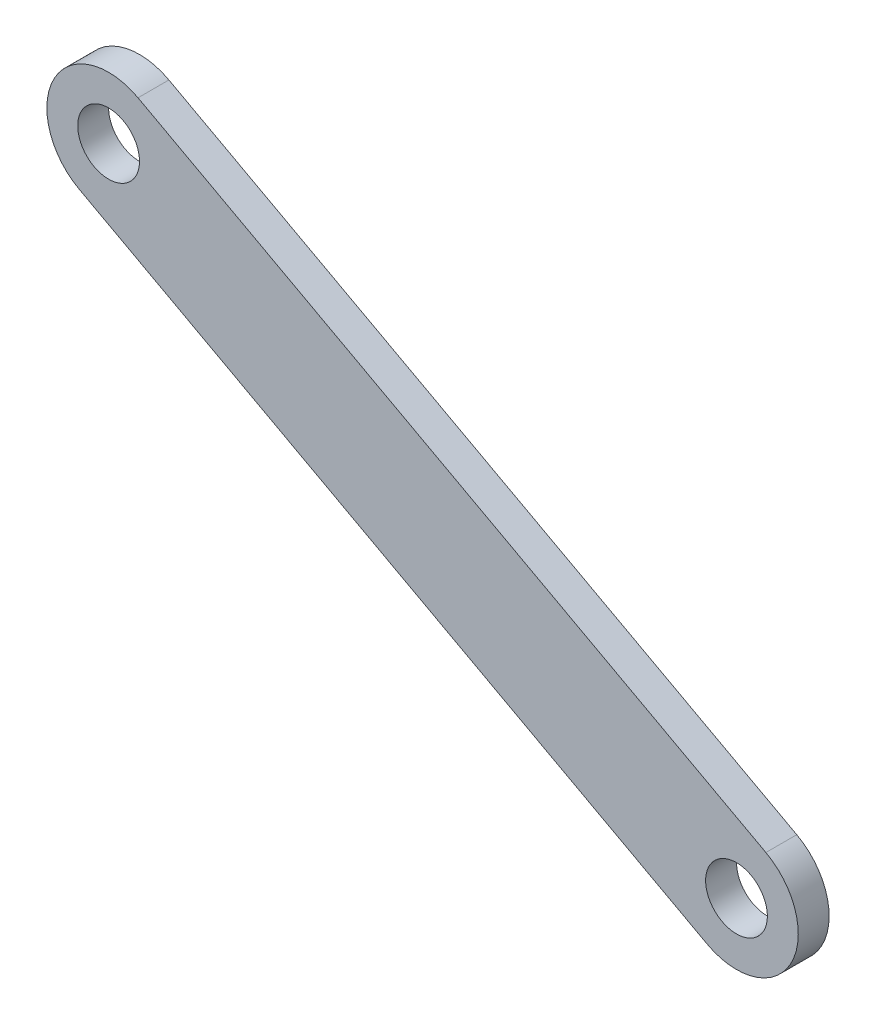
ISO-10303-21;
HEADER;
FILE_DESCRIPTION(('STEP AP214'),'2;1');
FILE_NAME('part.step','',(''),(''),'','','');
FILE_SCHEMA(('AUTOMOTIVE_DESIGN { 1 0 10303 214 1 1 1 1 }'));
ENDSEC;
DATA;
#1=APPLICATION_CONTEXT('core data for automotive mechanical design processes');
#2=APPLICATION_PROTOCOL_DEFINITION('international standard','automotive_design',2000,#1);
#3=PRODUCT_CONTEXT('',#1,'mechanical');
#4=PRODUCT('Part','Part','',(#3));
#5=PRODUCT_RELATED_PRODUCT_CATEGORY('part','',(#4));
#6=PRODUCT_DEFINITION_FORMATION('','',#4);
#7=PRODUCT_DEFINITION_CONTEXT('part definition',#1,'design');
#8=PRODUCT_DEFINITION('design','',#6,#7);
#9=PRODUCT_DEFINITION_SHAPE('','',#8);
#10=(LENGTH_UNIT() NAMED_UNIT(*) SI_UNIT(.MILLI.,.METRE.));
#11=(NAMED_UNIT(*) PLANE_ANGLE_UNIT() SI_UNIT($,.RADIAN.));
#12=(NAMED_UNIT(*) SI_UNIT($,.STERADIAN.) SOLID_ANGLE_UNIT());
#13=UNCERTAINTY_MEASURE_WITH_UNIT(LENGTH_MEASURE(1.E-05),#10,'distance_accuracy_value','');
#14=(GEOMETRIC_REPRESENTATION_CONTEXT(3) GLOBAL_UNCERTAINTY_ASSIGNED_CONTEXT((#13)) GLOBAL_UNIT_ASSIGNED_CONTEXT((#10,
#11,#12)) REPRESENTATION_CONTEXT('',''));
#15=CARTESIAN_POINT('',(0.,0.,0.));
#16=DIRECTION('',(0.,0.,1.));
#17=DIRECTION('',(1.,0.,0.));
#18=AXIS2_PLACEMENT_3D('',#15,#16,#17);
#19=CARTESIAN_POINT('',(-59.231514961415,-28.0529302307478,0.));
#20=DIRECTION('',(0.,0.,1.));
#21=DIRECTION('',(1.,0.,0.));
#22=AXIS2_PLACEMENT_3D('',#19,#20,#21);
#23=PLANE('',#22);
#24=CARTESIAN_POINT('',(-26.9521070315729,-45.5151701700811,0.));
#25=DIRECTION('',(0.,0.,1.));
#26=DIRECTION('',(1.,0.,0.));
#27=AXIS2_PLACEMENT_3D('',#24,#25,#26);
#28=CIRCLE('',#27,1.5875);
#29=CARTESIAN_POINT('',(-25.3646070315729,-45.5151701700811,0.));
#30=VERTEX_POINT('',#29);
#31=EDGE_CURVE('E101',#30,#30,#28,.T.);
#32=ORIENTED_EDGE('',*,*,#31,.F.);
#33=EDGE_LOOP('',(#32));
#34=FACE_BOUND('',#33,.T.);
#35=CARTESIAN_POINT('',(-59.231514961415,-28.0529302307478,0.));
#36=DIRECTION('',(0.,0.,1.));
#37=DIRECTION('',(1.,0.,0.));
#38=AXIS2_PLACEMENT_3D('',#35,#36,#37);
#39=CIRCLE('',#38,3.17500000000001);
#40=CARTESIAN_POINT('',(-57.720817092004,-25.2603656482614,0.));
#41=VERTEX_POINT('',#40);
#42=CARTESIAN_POINT('',(-60.742212830826,-30.8454948132341,0.));
#43=VERTEX_POINT('',#42);
#44=EDGE_CURVE('E86',#41,#43,#39,.T.);
#45=ORIENTED_EDGE('',*,*,#44,.T.);
#46=DIRECTION('',(0.879547899995697,-0.475810352570391,0.));
#47=VECTOR('',#46,1.);
#48=CARTESIAN_POINT('',(-60.742212830826,-30.8454948132341,0.));
#49=LINE('',#48,#47);
#50=CARTESIAN_POINT('',(-28.4628049009839,-48.3077347525675,0.));
#51=VERTEX_POINT('',#50);
#52=EDGE_CURVE('E81',#43,#51,#49,.T.);
#53=ORIENTED_EDGE('',*,*,#52,.T.);
#54=CARTESIAN_POINT('',(-26.9521070315729,-45.5151701700811,0.));
#55=DIRECTION('',(0.,0.,1.));
#56=DIRECTION('',(1.,0.,0.));
#57=AXIS2_PLACEMENT_3D('',#54,#55,#56);
#58=CIRCLE('',#57,3.17500000000001);
#59=CARTESIAN_POINT('',(-25.4414091621619,-42.7226055875948,0.));
#60=VERTEX_POINT('',#59);
#61=EDGE_CURVE('E84',#51,#60,#58,.T.);
#62=ORIENTED_EDGE('',*,*,#61,.T.);
#63=DIRECTION('',(-0.879547899995697,0.475810352570391,0.));
#64=VECTOR('',#63,1.);
#65=CARTESIAN_POINT('',(-57.720817092004,-25.2603656482614,0.));
#66=LINE('',#65,#64);
#67=EDGE_CURVE('E51',#60,#41,#66,.T.);
#68=ORIENTED_EDGE('',*,*,#67,.T.);
#69=EDGE_LOOP('',(#45,#53,#62,#68));
#70=FACE_BOUND('',#69,.T.);
#71=CARTESIAN_POINT('',(-59.231514961415,-28.0529302307478,0.));
#72=DIRECTION('',(0.,0.,1.));
#73=DIRECTION('',(1.,0.,0.));
#74=AXIS2_PLACEMENT_3D('',#71,#72,#73);
#75=CIRCLE('',#74,1.5875);
#76=CARTESIAN_POINT('',(-57.644014961415,-28.0529302307478,0.));
#77=VERTEX_POINT('',#76);
#78=EDGE_CURVE('E116',#77,#77,#75,.T.);
#79=ORIENTED_EDGE('',*,*,#78,.F.);
#80=EDGE_LOOP('',(#79));
#81=FACE_BOUND('',#80,.T.);
#82=ADVANCED_FACE('F34',(#34,#70,#81),#23,.T.);
#83=CARTESIAN_POINT('',(-59.231514961415,-28.0529302307478,-1.5875));
#84=DIRECTION('',(0.,0.,1.));
#85=DIRECTION('',(1.,0.,0.));
#86=AXIS2_PLACEMENT_3D('',#83,#84,#85);
#87=PLANE('',#86);
#88=CARTESIAN_POINT('',(-26.9521070315729,-45.5151701700811,-1.5875));
#89=DIRECTION('',(0.,0.,1.));
#90=DIRECTION('',(1.,0.,0.));
#91=AXIS2_PLACEMENT_3D('',#88,#89,#90);
#92=CIRCLE('',#91,1.5875);
#93=CARTESIAN_POINT('',(-25.3646070315729,-45.5151701700811,-1.5875));
#94=VERTEX_POINT('',#93);
#95=EDGE_CURVE('E113',#94,#94,#92,.T.);
#96=ORIENTED_EDGE('',*,*,#95,.T.);
#97=EDGE_LOOP('',(#96));
#98=FACE_BOUND('',#97,.T.);
#99=CARTESIAN_POINT('',(-59.231514961415,-28.0529302307478,-1.5875));
#100=DIRECTION('',(0.,0.,1.));
#101=DIRECTION('',(1.,0.,0.));
#102=AXIS2_PLACEMENT_3D('',#99,#100,#101);
#103=CIRCLE('',#102,3.17500000000001);
#104=CARTESIAN_POINT('',(-57.720817092004,-25.2603656482614,-1.5875));
#105=VERTEX_POINT('',#104);
#106=CARTESIAN_POINT('',(-60.742212830826,-30.8454948132341,-1.5875));
#107=VERTEX_POINT('',#106);
#108=EDGE_CURVE('E98',#105,#107,#103,.T.);
#109=ORIENTED_EDGE('',*,*,#108,.F.);
#110=DIRECTION('',(-0.879547899995697,0.475810352570391,0.));
#111=VECTOR('',#110,1.);
#112=CARTESIAN_POINT('',(-57.720817092004,-25.2603656482614,-1.5875));
#113=LINE('',#112,#111);
#114=CARTESIAN_POINT('',(-25.4414091621619,-42.7226055875948,-1.5875));
#115=VERTEX_POINT('',#114);
#116=EDGE_CURVE('E74',#115,#105,#113,.T.);
#117=ORIENTED_EDGE('',*,*,#116,.F.);
#118=CARTESIAN_POINT('',(-26.9521070315729,-45.5151701700811,-1.5875));
#119=DIRECTION('',(0.,0.,1.));
#120=DIRECTION('',(1.,0.,0.));
#121=AXIS2_PLACEMENT_3D('',#118,#119,#120);
#122=CIRCLE('',#121,3.17500000000001);
#123=CARTESIAN_POINT('',(-28.4628049009839,-48.3077347525675,-1.5875));
#124=VERTEX_POINT('',#123);
#125=EDGE_CURVE('E68',#124,#115,#122,.T.);
#126=ORIENTED_EDGE('',*,*,#125,.F.);
#127=DIRECTION('',(0.879547899995697,-0.475810352570391,0.));
#128=VECTOR('',#127,1.);
#129=CARTESIAN_POINT('',(-60.742212830826,-30.8454948132341,-1.5875));
#130=LINE('',#129,#128);
#131=EDGE_CURVE('E90',#107,#124,#130,.T.);
#132=ORIENTED_EDGE('',*,*,#131,.F.);
#133=EDGE_LOOP('',(#109,#117,#126,#132));
#134=FACE_BOUND('',#133,.T.);
#135=CARTESIAN_POINT('',(-59.231514961415,-28.0529302307478,-1.5875));
#136=DIRECTION('',(0.,0.,1.));
#137=DIRECTION('',(1.,0.,0.));
#138=AXIS2_PLACEMENT_3D('',#135,#136,#137);
#139=CIRCLE('',#138,1.5875);
#140=CARTESIAN_POINT('',(-57.644014961415,-28.0529302307478,-1.5875));
#141=VERTEX_POINT('',#140);
#142=EDGE_CURVE('E119',#141,#141,#139,.T.);
#143=ORIENTED_EDGE('',*,*,#142,.T.);
#144=EDGE_LOOP('',(#143));
#145=FACE_BOUND('',#144,.T.);
#146=ADVANCED_FACE('F109',(#98,#134,#145),#87,.F.);
#147=CARTESIAN_POINT('',(-59.231514961415,-28.0529302307478,0.));
#148=DIRECTION('',(0.,0.,-1.));
#149=DIRECTION('',(-1.,0.,0.));
#150=AXIS2_PLACEMENT_3D('',#147,#148,#149);
#151=CYLINDRICAL_SURFACE('',#150,3.17500000000001);
#152=ORIENTED_EDGE('',*,*,#108,.T.);
#153=DIRECTION('',(0.,0.,-1.));
#154=VECTOR('',#153,1.);
#155=CARTESIAN_POINT('',(-60.742212830826,-30.8454948132341,0.));
#156=LINE('',#155,#154);
#157=EDGE_CURVE('E11',#43,#107,#156,.T.);
#158=ORIENTED_EDGE('',*,*,#157,.F.);
#159=ORIENTED_EDGE('',*,*,#44,.F.);
#160=DIRECTION('',(0.,0.,-1.));
#161=VECTOR('',#160,1.);
#162=CARTESIAN_POINT('',(-57.720817092004,-25.2603656482614,0.));
#163=LINE('',#162,#161);
#164=EDGE_CURVE('E94',#41,#105,#163,.T.);
#165=ORIENTED_EDGE('',*,*,#164,.T.);
#166=EDGE_LOOP('',(#152,#158,#159,#165));
#167=FACE_BOUND('',#166,.T.);
#168=ADVANCED_FACE('F36',(#167),#151,.T.);
#169=CARTESIAN_POINT('',(-60.742212830826,-30.8454948132341,0.));
#170=DIRECTION('',(0.475810352570391,0.879547899995697,0.));
#171=DIRECTION('',(-0.879547899995697,0.475810352570391,0.));
#172=AXIS2_PLACEMENT_3D('',#169,#170,#171);
#173=PLANE('',#172);
#174=ORIENTED_EDGE('',*,*,#131,.T.);
#175=DIRECTION('',(0.,0.,-1.));
#176=VECTOR('',#175,1.);
#177=CARTESIAN_POINT('',(-28.4628049009839,-48.3077347525675,0.));
#178=LINE('',#177,#176);
#179=EDGE_CURVE('E43',#51,#124,#178,.T.);
#180=ORIENTED_EDGE('',*,*,#179,.F.);
#181=ORIENTED_EDGE('',*,*,#52,.F.);
#182=ORIENTED_EDGE('',*,*,#157,.T.);
#183=EDGE_LOOP('',(#174,#180,#181,#182));
#184=FACE_BOUND('',#183,.T.);
#185=ADVANCED_FACE('F89',(#184),#173,.F.);
#186=CARTESIAN_POINT('',(-26.9521070315729,-45.5151701700811,0.));
#187=DIRECTION('',(0.,0.,-1.));
#188=DIRECTION('',(-1.,0.,0.));
#189=AXIS2_PLACEMENT_3D('',#186,#187,#188);
#190=CYLINDRICAL_SURFACE('',#189,3.17500000000001);
#191=ORIENTED_EDGE('',*,*,#125,.T.);
#192=DIRECTION('',(0.,0.,-1.));
#193=VECTOR('',#192,1.);
#194=CARTESIAN_POINT('',(-25.4414091621619,-42.7226055875948,0.));
#195=LINE('',#194,#193);
#196=EDGE_CURVE('E91',#60,#115,#195,.T.);
#197=ORIENTED_EDGE('',*,*,#196,.F.);
#198=ORIENTED_EDGE('',*,*,#61,.F.);
#199=ORIENTED_EDGE('',*,*,#179,.T.);
#200=EDGE_LOOP('',(#191,#197,#198,#199));
#201=FACE_BOUND('',#200,.T.);
#202=ADVANCED_FACE('F92',(#201),#190,.T.);
#203=CARTESIAN_POINT('',(-57.720817092004,-25.2603656482614,0.));
#204=DIRECTION('',(-0.475810352570391,-0.879547899995697,0.));
#205=DIRECTION('',(0.879547899995697,-0.475810352570391,0.));
#206=AXIS2_PLACEMENT_3D('',#203,#204,#205);
#207=PLANE('',#206);
#208=ORIENTED_EDGE('',*,*,#116,.T.);
#209=ORIENTED_EDGE('',*,*,#164,.F.);
#210=ORIENTED_EDGE('',*,*,#67,.F.);
#211=ORIENTED_EDGE('',*,*,#196,.T.);
#212=EDGE_LOOP('',(#208,#209,#210,#211));
#213=FACE_BOUND('',#212,.T.);
#214=ADVANCED_FACE('F106',(#213),#207,.F.);
#215=CARTESIAN_POINT('',(-26.9521070315729,-45.5151701700811,0.));
#216=DIRECTION('',(0.,0.,-1.));
#217=DIRECTION('',(-1.,0.,0.));
#218=AXIS2_PLACEMENT_3D('',#215,#216,#217);
#219=CYLINDRICAL_SURFACE('',#218,1.5875);
#220=ORIENTED_EDGE('',*,*,#31,.T.);
#221=EDGE_LOOP('',(#220));
#222=FACE_BOUND('',#221,.T.);
#223=ORIENTED_EDGE('',*,*,#95,.F.);
#224=EDGE_LOOP('',(#223));
#225=FACE_BOUND('',#224,.T.);
#226=ADVANCED_FACE('F137',(#222,#225),#219,.F.);
#227=CARTESIAN_POINT('',(-59.231514961415,-28.0529302307478,0.));
#228=DIRECTION('',(0.,0.,-1.));
#229=DIRECTION('',(-1.,0.,0.));
#230=AXIS2_PLACEMENT_3D('',#227,#228,#229);
#231=CYLINDRICAL_SURFACE('',#230,1.5875);
#232=ORIENTED_EDGE('',*,*,#78,.T.);
#233=EDGE_LOOP('',(#232));
#234=FACE_BOUND('',#233,.T.);
#235=ORIENTED_EDGE('',*,*,#142,.F.);
#236=EDGE_LOOP('',(#235));
#237=FACE_BOUND('',#236,.T.);
#238=ADVANCED_FACE('F125',(#234,#237),#231,.F.);
#239=CLOSED_SHELL('',(#82,#146,#168,#185,#202,#214,#226,#238));
#240=MANIFOLD_SOLID_BREP('B2',#239);
#241=ADVANCED_BREP_SHAPE_REPRESENTATION('',(#18,#240),#14);
#242=SHAPE_DEFINITION_REPRESENTATION(#9,#241);
ENDSEC;
END-ISO-10303-21;
